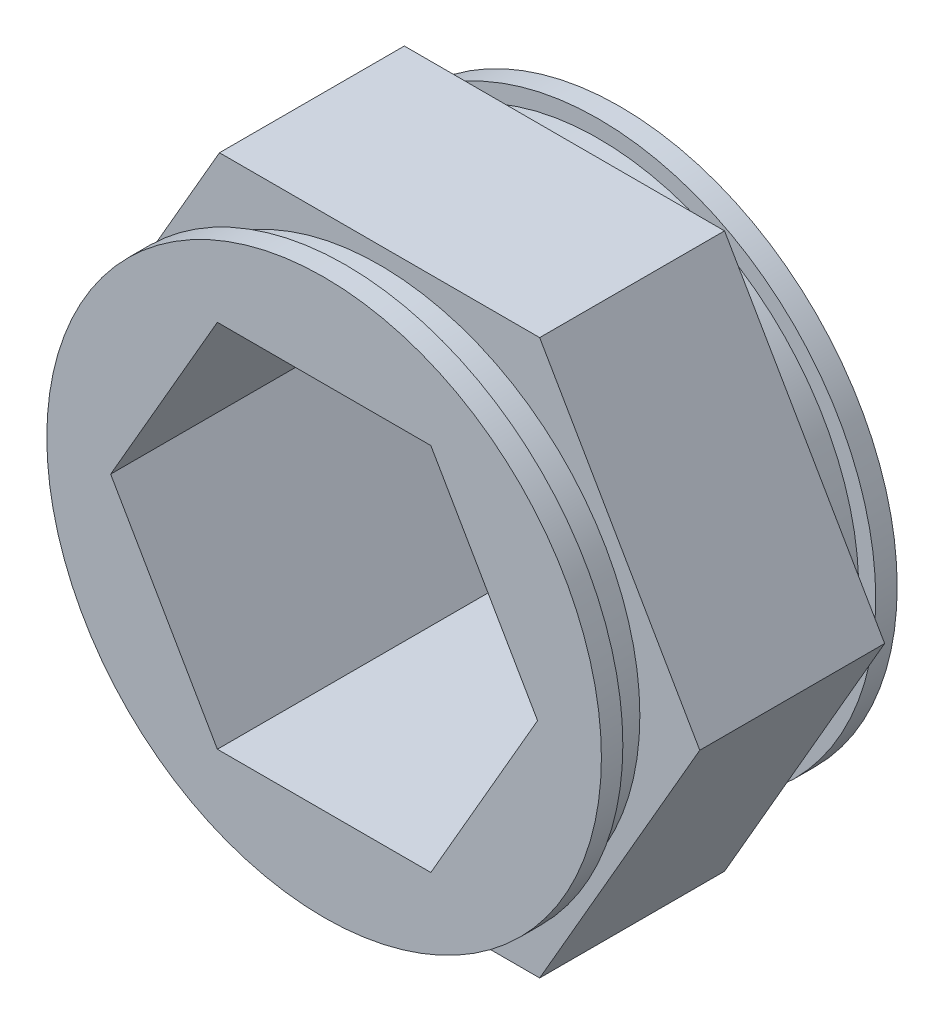
ISO-10303-21;
HEADER;
FILE_DESCRIPTION(('STEP AP214'),'2;1');
FILE_NAME('part.step','',(''),(''),'','','');
FILE_SCHEMA(('AUTOMOTIVE_DESIGN { 1 0 10303 214 1 1 1 1 }'));
ENDSEC;
DATA;
#1=APPLICATION_CONTEXT('core data for automotive mechanical design processes');
#2=APPLICATION_PROTOCOL_DEFINITION('international standard','automotive_design',2000,#1);
#3=PRODUCT_CONTEXT('',#1,'mechanical');
#4=PRODUCT('Part','Part','',(#3));
#5=PRODUCT_RELATED_PRODUCT_CATEGORY('part','',(#4));
#6=PRODUCT_DEFINITION_FORMATION('','',#4);
#7=PRODUCT_DEFINITION_CONTEXT('part definition',#1,'design');
#8=PRODUCT_DEFINITION('design','',#6,#7);
#9=PRODUCT_DEFINITION_SHAPE('','',#8);
#10=(LENGTH_UNIT() NAMED_UNIT(*) SI_UNIT(.MILLI.,.METRE.));
#11=(NAMED_UNIT(*) PLANE_ANGLE_UNIT() SI_UNIT($,.RADIAN.));
#12=(NAMED_UNIT(*) SI_UNIT($,.STERADIAN.) SOLID_ANGLE_UNIT());
#13=UNCERTAINTY_MEASURE_WITH_UNIT(LENGTH_MEASURE(1.E-05),#10,'distance_accuracy_value','');
#14=(GEOMETRIC_REPRESENTATION_CONTEXT(3) GLOBAL_UNCERTAINTY_ASSIGNED_CONTEXT((#13)) GLOBAL_UNIT_ASSIGNED_CONTEXT((#10,
#11,#12)) REPRESENTATION_CONTEXT('',''));
#15=CARTESIAN_POINT('',(0.,0.,0.));
#16=DIRECTION('',(0.,0.,1.));
#17=DIRECTION('',(1.,0.,0.));
#18=AXIS2_PLACEMENT_3D('',#15,#16,#17);
#19=CARTESIAN_POINT('',(0.,0.,0.));
#20=DIRECTION('',(0.,0.,1.));
#21=DIRECTION('',(1.,0.,0.));
#22=AXIS2_PLACEMENT_3D('',#19,#20,#21);
#23=PLANE('',#22);
#24=CARTESIAN_POINT('',(0.,0.,0.));
#25=DIRECTION('',(0.,0.,-1.));
#26=DIRECTION('',(-1.,0.,0.));
#27=AXIS2_PLACEMENT_3D('',#24,#25,#26);
#28=CIRCLE('',#27,8.9408);
#29=CARTESIAN_POINT('',(-8.9408,0.,0.));
#30=VERTEX_POINT('',#29);
#31=EDGE_CURVE('E20',#30,#30,#28,.T.);
#32=ORIENTED_EDGE('',*,*,#31,.F.);
#33=EDGE_LOOP('',(#32));
#34=FACE_BOUND('',#33,.T.);
#35=DIRECTION('',(0.5,0.866025403784438,0.));
#36=VECTOR('',#35,1.);
#37=CARTESIAN_POINT('',(5.49926131403117,-9.525,0.));
#38=LINE('',#37,#36);
#39=CARTESIAN_POINT('',(5.49926131403117,-9.525,0.));
#40=VERTEX_POINT('',#39);
#41=CARTESIAN_POINT('',(10.9985226280624,0.,0.));
#42=VERTEX_POINT('',#41);
#43=EDGE_CURVE('E179',#40,#42,#38,.T.);
#44=ORIENTED_EDGE('',*,*,#43,.F.);
#45=DIRECTION('',(1.,0.,0.));
#46=VECTOR('',#45,1.);
#47=CARTESIAN_POINT('',(-5.49926131403119,-9.525,0.));
#48=LINE('',#47,#46);
#49=CARTESIAN_POINT('',(-5.4992613140312,-9.525,0.));
#50=VERTEX_POINT('',#49);
#51=EDGE_CURVE('E184',#50,#40,#48,.T.);
#52=ORIENTED_EDGE('',*,*,#51,.F.);
#53=DIRECTION('',(0.5,-0.866025403784439,0.));
#54=VECTOR('',#53,1.);
#55=CARTESIAN_POINT('',(-10.9985226280624,0.,0.));
#56=LINE('',#55,#54);
#57=CARTESIAN_POINT('',(-10.9985226280624,0.,0.));
#58=VERTEX_POINT('',#57);
#59=EDGE_CURVE('E190',#58,#50,#56,.T.);
#60=ORIENTED_EDGE('',*,*,#59,.F.);
#61=DIRECTION('',(-0.5,-0.866025403784439,0.));
#62=VECTOR('',#61,1.);
#63=CARTESIAN_POINT('',(-5.49926131403119,9.525,0.));
#64=LINE('',#63,#62);
#65=CARTESIAN_POINT('',(-5.49926131403119,9.525,0.));
#66=VERTEX_POINT('',#65);
#67=EDGE_CURVE('E104',#66,#58,#64,.T.);
#68=ORIENTED_EDGE('',*,*,#67,.F.);
#69=DIRECTION('',(1.,0.,0.));
#70=VECTOR('',#69,1.);
#71=CARTESIAN_POINT('',(5.49926131403117,9.525,0.));
#72=LINE('',#71,#70);
#73=CARTESIAN_POINT('',(5.49926131403117,9.525,0.));
#74=VERTEX_POINT('',#73);
#75=EDGE_CURVE('E106',#74,#66,#72,.F.);
#76=ORIENTED_EDGE('',*,*,#75,.F.);
#77=DIRECTION('',(-0.5,0.866025403784439,0.));
#78=VECTOR('',#77,1.);
#79=CARTESIAN_POINT('',(10.9985226280624,0.,0.));
#80=LINE('',#79,#78);
#81=EDGE_CURVE('E108',#42,#74,#80,.T.);
#82=ORIENTED_EDGE('',*,*,#81,.F.);
#83=EDGE_LOOP('',(#44,#52,#60,#68,#76,#82));
#84=FACE_BOUND('',#83,.T.);
#85=ADVANCED_FACE('F17',(#34,#84),#23,.F.);
#86=CARTESIAN_POINT('',(10.9985226280624,0.,0.));
#87=DIRECTION('',(0.866025403784439,0.5,0.));
#88=DIRECTION('',(-0.5,0.866025403784439,0.));
#89=AXIS2_PLACEMENT_3D('',#86,#87,#88);
#90=PLANE('',#89);
#91=DIRECTION('',(-0.500000000000001,0.866025403784438,0.));
#92=VECTOR('',#91,1.);
#93=CARTESIAN_POINT('',(10.9985226280624,0.,6.35));
#94=LINE('',#93,#92);
#95=CARTESIAN_POINT('',(10.9985226280624,0.,6.35));
#96=VERTEX_POINT('',#95);
#97=CARTESIAN_POINT('',(5.49926131403117,9.525,6.35));
#98=VERTEX_POINT('',#97);
#99=EDGE_CURVE('E173',#96,#98,#94,.T.);
#100=ORIENTED_EDGE('',*,*,#99,.F.);
#101=DIRECTION('',(0.,0.,1.));
#102=VECTOR('',#101,1.);
#103=CARTESIAN_POINT('',(10.9985226280624,0.,0.));
#104=LINE('',#103,#102);
#105=EDGE_CURVE('E119',#42,#96,#104,.T.);
#106=ORIENTED_EDGE('',*,*,#105,.F.);
#107=ORIENTED_EDGE('',*,*,#81,.T.);
#108=DIRECTION('',(0.,0.,1.));
#109=VECTOR('',#108,1.);
#110=CARTESIAN_POINT('',(5.49926131403117,9.525,0.));
#111=LINE('',#110,#109);
#112=EDGE_CURVE('E113',#98,#74,#111,.F.);
#113=ORIENTED_EDGE('',*,*,#112,.F.);
#114=EDGE_LOOP('',(#100,#106,#107,#113));
#115=FACE_BOUND('',#114,.T.);
#116=ADVANCED_FACE('F116',(#115),#90,.T.);
#117=CARTESIAN_POINT('',(5.49926131403117,9.525,0.));
#118=DIRECTION('',(0.,1.,0.));
#119=DIRECTION('',(0.,0.,1.));
#120=AXIS2_PLACEMENT_3D('',#117,#118,#119);
#121=PLANE('',#120);
#122=DIRECTION('',(1.,0.,0.));
#123=VECTOR('',#122,1.);
#124=CARTESIAN_POINT('',(0.,9.525,6.35));
#125=LINE('',#124,#123);
#126=CARTESIAN_POINT('',(-5.49926131403119,9.525,6.35));
#127=VERTEX_POINT('',#126);
#128=EDGE_CURVE('E124',#98,#127,#125,.F.);
#129=ORIENTED_EDGE('',*,*,#128,.F.);
#130=ORIENTED_EDGE('',*,*,#112,.T.);
#131=ORIENTED_EDGE('',*,*,#75,.T.);
#132=DIRECTION('',(0.,0.,1.));
#133=VECTOR('',#132,1.);
#134=CARTESIAN_POINT('',(-5.49926131403119,9.525,0.));
#135=LINE('',#134,#133);
#136=EDGE_CURVE('E127',#127,#66,#135,.F.);
#137=ORIENTED_EDGE('',*,*,#136,.F.);
#138=EDGE_LOOP('',(#129,#130,#131,#137));
#139=FACE_BOUND('',#138,.T.);
#140=ADVANCED_FACE('F122',(#139),#121,.T.);
#141=CARTESIAN_POINT('',(-5.49926131403119,9.525,0.));
#142=DIRECTION('',(-0.866025403784439,0.5,0.));
#143=DIRECTION('',(-0.5,-0.866025403784439,0.));
#144=AXIS2_PLACEMENT_3D('',#141,#142,#143);
#145=PLANE('',#144);
#146=DIRECTION('',(-0.500000000000001,-0.866025403784438,0.));
#147=VECTOR('',#146,1.);
#148=CARTESIAN_POINT('',(-5.49926131403119,9.525,6.35));
#149=LINE('',#148,#147);
#150=CARTESIAN_POINT('',(-10.9985226280624,0.,6.35));
#151=VERTEX_POINT('',#150);
#152=EDGE_CURVE('E169',#127,#151,#149,.T.);
#153=ORIENTED_EDGE('',*,*,#152,.F.);
#154=ORIENTED_EDGE('',*,*,#136,.T.);
#155=ORIENTED_EDGE('',*,*,#67,.T.);
#156=DIRECTION('',(0.,0.,1.));
#157=VECTOR('',#156,1.);
#158=CARTESIAN_POINT('',(-10.9985226280624,0.,0.));
#159=LINE('',#158,#157);
#160=EDGE_CURVE('E187',#151,#58,#159,.F.);
#161=ORIENTED_EDGE('',*,*,#160,.F.);
#162=EDGE_LOOP('',(#153,#154,#155,#161));
#163=FACE_BOUND('',#162,.T.);
#164=ADVANCED_FACE('F194',(#163),#145,.T.);
#165=CARTESIAN_POINT('',(-10.9985226280624,0.,0.));
#166=DIRECTION('',(-0.866025403784439,-0.5,0.));
#167=DIRECTION('',(0.5,-0.866025403784439,0.));
#168=AXIS2_PLACEMENT_3D('',#165,#166,#167);
#169=PLANE('',#168);
#170=DIRECTION('',(0.5,-0.866025403784438,0.));
#171=VECTOR('',#170,1.);
#172=CARTESIAN_POINT('',(-10.9985226280624,0.,6.35));
#173=LINE('',#172,#171);
#174=CARTESIAN_POINT('',(-5.4992613140312,-9.525,6.35));
#175=VERTEX_POINT('',#174);
#176=EDGE_CURVE('E162',#151,#175,#173,.T.);
#177=ORIENTED_EDGE('',*,*,#176,.F.);
#178=ORIENTED_EDGE('',*,*,#160,.T.);
#179=ORIENTED_EDGE('',*,*,#59,.T.);
#180=DIRECTION('',(0.,0.,-1.));
#181=VECTOR('',#180,1.);
#182=CARTESIAN_POINT('',(-5.49926131403119,-9.525,0.));
#183=LINE('',#182,#181);
#184=EDGE_CURVE('E181',#175,#50,#183,.T.);
#185=ORIENTED_EDGE('',*,*,#184,.F.);
#186=EDGE_LOOP('',(#177,#178,#179,#185));
#187=FACE_BOUND('',#186,.T.);
#188=ADVANCED_FACE('F203',(#187),#169,.T.);
#189=CARTESIAN_POINT('',(-5.49926131403119,-9.525,0.));
#190=DIRECTION('',(0.,-1.,0.));
#191=DIRECTION('',(0.,0.,-1.));
#192=AXIS2_PLACEMENT_3D('',#189,#190,#191);
#193=PLANE('',#192);
#194=DIRECTION('',(1.,0.,0.));
#195=VECTOR('',#194,1.);
#196=CARTESIAN_POINT('',(0.,-9.525,6.35));
#197=LINE('',#196,#195);
#198=CARTESIAN_POINT('',(5.49926131403117,-9.525,6.35));
#199=VERTEX_POINT('',#198);
#200=EDGE_CURVE('E157',#175,#199,#197,.T.);
#201=ORIENTED_EDGE('',*,*,#200,.F.);
#202=ORIENTED_EDGE('',*,*,#184,.T.);
#203=ORIENTED_EDGE('',*,*,#51,.T.);
#204=DIRECTION('',(0.,0.,1.));
#205=VECTOR('',#204,1.);
#206=CARTESIAN_POINT('',(5.49926131403117,-9.525,0.));
#207=LINE('',#206,#205);
#208=EDGE_CURVE('E175',#199,#40,#207,.F.);
#209=ORIENTED_EDGE('',*,*,#208,.F.);
#210=EDGE_LOOP('',(#201,#202,#203,#209));
#211=FACE_BOUND('',#210,.T.);
#212=ADVANCED_FACE('F201',(#211),#193,.T.);
#213=CARTESIAN_POINT('',(5.49926131403117,-9.525,0.));
#214=DIRECTION('',(0.866025403784438,-0.5,0.));
#215=DIRECTION('',(0.5,0.866025403784438,0.));
#216=AXIS2_PLACEMENT_3D('',#213,#214,#215);
#217=PLANE('',#216);
#218=DIRECTION('',(0.500000000000001,0.866025403784438,0.));
#219=VECTOR('',#218,1.);
#220=CARTESIAN_POINT('',(5.49926131403117,-9.525,6.35));
#221=LINE('',#220,#219);
#222=EDGE_CURVE('E153',#199,#96,#221,.T.);
#223=ORIENTED_EDGE('',*,*,#222,.F.);
#224=ORIENTED_EDGE('',*,*,#208,.T.);
#225=ORIENTED_EDGE('',*,*,#43,.T.);
#226=ORIENTED_EDGE('',*,*,#105,.T.);
#227=EDGE_LOOP('',(#223,#224,#225,#226));
#228=FACE_BOUND('',#227,.T.);
#229=ADVANCED_FACE('F198',(#228),#217,.T.);
#230=CARTESIAN_POINT('',(0.,0.,0.));
#231=DIRECTION('',(0.,0.,-1.));
#232=DIRECTION('',(-1.,0.,0.));
#233=AXIS2_PLACEMENT_3D('',#230,#231,#232);
#234=CYLINDRICAL_SURFACE('',#233,8.9408);
#235=ORIENTED_EDGE('',*,*,#31,.T.);
#236=EDGE_LOOP('',(#235));
#237=FACE_BOUND('',#236,.T.);
#238=CARTESIAN_POINT('',(0.,0.,-1.1684));
#239=DIRECTION('',(0.,0.,-1.));
#240=DIRECTION('',(-1.,0.,0.));
#241=AXIS2_PLACEMENT_3D('',#238,#239,#240);
#242=CIRCLE('',#241,8.9408);
#243=CARTESIAN_POINT('',(-8.9408,0.,-1.1684));
#244=VERTEX_POINT('',#243);
#245=EDGE_CURVE('E151',#244,#244,#242,.T.);
#246=ORIENTED_EDGE('',*,*,#245,.F.);
#247=EDGE_LOOP('',(#246));
#248=FACE_BOUND('',#247,.T.);
#249=ADVANCED_FACE('F270',(#237,#248),#234,.T.);
#250=CARTESIAN_POINT('',(0.,0.,6.35));
#251=DIRECTION('',(0.,0.,1.));
#252=DIRECTION('',(1.,0.,0.));
#253=AXIS2_PLACEMENT_3D('',#250,#251,#252);
#254=PLANE('',#253);
#255=CARTESIAN_POINT('',(0.,0.,6.35));
#256=DIRECTION('',(0.,0.,1.));
#257=DIRECTION('',(1.,0.,0.));
#258=AXIS2_PLACEMENT_3D('',#255,#256,#257);
#259=CIRCLE('',#258,8.9408);
#260=CARTESIAN_POINT('',(8.9408,0.,6.35));
#261=VERTEX_POINT('',#260);
#262=EDGE_CURVE('E149',#261,#261,#259,.T.);
#263=ORIENTED_EDGE('',*,*,#262,.F.);
#264=EDGE_LOOP('',(#263));
#265=FACE_BOUND('',#264,.T.);
#266=ORIENTED_EDGE('',*,*,#200,.T.);
#267=ORIENTED_EDGE('',*,*,#222,.T.);
#268=ORIENTED_EDGE('',*,*,#99,.T.);
#269=ORIENTED_EDGE('',*,*,#128,.T.);
#270=ORIENTED_EDGE('',*,*,#152,.T.);
#271=ORIENTED_EDGE('',*,*,#176,.T.);
#272=EDGE_LOOP('',(#266,#267,#268,#269,#270,#271));
#273=FACE_BOUND('',#272,.T.);
#274=ADVANCED_FACE('F196',(#265,#273),#254,.T.);
#275=CARTESIAN_POINT('',(0.,0.,-1.1684));
#276=DIRECTION('',(0.,0.,1.));
#277=DIRECTION('',(1.,0.,0.));
#278=AXIS2_PLACEMENT_3D('',#275,#276,#277);
#279=PLANE('',#278);
#280=ORIENTED_EDGE('',*,*,#245,.T.);
#281=EDGE_LOOP('',(#280));
#282=FACE_BOUND('',#281,.T.);
#283=CARTESIAN_POINT('',(0.,0.,-1.1684));
#284=DIRECTION('',(0.,0.,-1.));
#285=DIRECTION('',(-1.,0.,0.));
#286=AXIS2_PLACEMENT_3D('',#283,#284,#285);
#287=CIRCLE('',#286,9.525);
#288=CARTESIAN_POINT('',(-9.525,0.,-1.1684));
#289=VERTEX_POINT('',#288);
#290=EDGE_CURVE('E146',#289,#289,#287,.T.);
#291=ORIENTED_EDGE('',*,*,#290,.F.);
#292=EDGE_LOOP('',(#291));
#293=FACE_BOUND('',#292,.T.);
#294=ADVANCED_FACE('F264',(#282,#293),#279,.T.);
#295=CARTESIAN_POINT('',(0.,0.,6.35));
#296=DIRECTION('',(0.,0.,1.));
#297=DIRECTION('',(1.,0.,0.));
#298=AXIS2_PLACEMENT_3D('',#295,#296,#297);
#299=CYLINDRICAL_SURFACE('',#298,8.9408);
#300=ORIENTED_EDGE('',*,*,#262,.T.);
#301=EDGE_LOOP('',(#300));
#302=FACE_BOUND('',#301,.T.);
#303=CARTESIAN_POINT('',(0.,0.,7.5184));
#304=DIRECTION('',(0.,0.,1.));
#305=DIRECTION('',(1.,0.,0.));
#306=AXIS2_PLACEMENT_3D('',#303,#304,#305);
#307=CIRCLE('',#306,8.9408);
#308=CARTESIAN_POINT('',(8.9408,0.,7.5184));
#309=VERTEX_POINT('',#308);
#310=EDGE_CURVE('E143',#309,#309,#307,.F.);
#311=ORIENTED_EDGE('',*,*,#310,.T.);
#312=EDGE_LOOP('',(#311));
#313=FACE_BOUND('',#312,.T.);
#314=ADVANCED_FACE('F260',(#302,#313),#299,.T.);
#315=CARTESIAN_POINT('',(0.,0.,-1.1684));
#316=DIRECTION('',(0.,0.,-1.));
#317=DIRECTION('',(-1.,0.,0.));
#318=AXIS2_PLACEMENT_3D('',#315,#316,#317);
#319=CYLINDRICAL_SURFACE('',#318,9.525);
#320=ORIENTED_EDGE('',*,*,#290,.T.);
#321=EDGE_LOOP('',(#320));
#322=FACE_BOUND('',#321,.T.);
#323=CARTESIAN_POINT('',(0.,0.,-1.905));
#324=DIRECTION('',(0.,0.,-1.));
#325=DIRECTION('',(-1.,0.,0.));
#326=AXIS2_PLACEMENT_3D('',#323,#324,#325);
#327=CIRCLE('',#326,9.525);
#328=CARTESIAN_POINT('',(-9.525,0.,-1.905));
#329=VERTEX_POINT('',#328);
#330=EDGE_CURVE('E140',#329,#329,#327,.F.);
#331=ORIENTED_EDGE('',*,*,#330,.T.);
#332=EDGE_LOOP('',(#331));
#333=FACE_BOUND('',#332,.T.);
#334=ADVANCED_FACE('F256',(#322,#333),#319,.T.);
#335=CARTESIAN_POINT('',(0.,0.,7.5184));
#336=DIRECTION('',(0.,0.,1.));
#337=DIRECTION('',(1.,0.,0.));
#338=AXIS2_PLACEMENT_3D('',#335,#336,#337);
#339=PLANE('',#338);
#340=ORIENTED_EDGE('',*,*,#310,.F.);
#341=EDGE_LOOP('',(#340));
#342=FACE_BOUND('',#341,.T.);
#343=CARTESIAN_POINT('',(0.,0.,7.5184));
#344=DIRECTION('',(0.,0.,1.));
#345=DIRECTION('',(1.,0.,0.));
#346=AXIS2_PLACEMENT_3D('',#343,#344,#345);
#347=CIRCLE('',#346,9.525);
#348=CARTESIAN_POINT('',(9.525,0.,7.5184));
#349=VERTEX_POINT('',#348);
#350=EDGE_CURVE('E136',#349,#349,#347,.T.);
#351=ORIENTED_EDGE('',*,*,#350,.F.);
#352=EDGE_LOOP('',(#351));
#353=FACE_BOUND('',#352,.T.);
#354=ADVANCED_FACE('F252',(#342,#353),#339,.F.);
#355=CARTESIAN_POINT('',(0.,0.,-1.905));
#356=DIRECTION('',(0.,0.,1.));
#357=DIRECTION('',(1.,0.,0.));
#358=AXIS2_PLACEMENT_3D('',#355,#356,#357);
#359=PLANE('',#358);
#360=DIRECTION('',(-0.5,-0.866025403784439,0.));
#361=VECTOR('',#360,1.);
#362=CARTESIAN_POINT('',(-3.66617420935411,6.35,-1.905));
#363=LINE('',#362,#361);
#364=CARTESIAN_POINT('',(-3.66617420935411,6.35,-1.905));
#365=VERTEX_POINT('',#364);
#366=CARTESIAN_POINT('',(-7.33234841870825,0.,-1.905));
#367=VERTEX_POINT('',#366);
#368=EDGE_CURVE('E386',#365,#367,#363,.T.);
#369=ORIENTED_EDGE('',*,*,#368,.T.);
#370=DIRECTION('',(0.5,-0.866025403784439,0.));
#371=VECTOR('',#370,1.);
#372=CARTESIAN_POINT('',(-7.33234841870825,0.,-1.905));
#373=LINE('',#372,#371);
#374=CARTESIAN_POINT('',(-3.66617420935412,-6.35,-1.905));
#375=VERTEX_POINT('',#374);
#376=EDGE_CURVE('E139',#367,#375,#373,.T.);
#377=ORIENTED_EDGE('',*,*,#376,.T.);
#378=DIRECTION('',(1.,0.,0.));
#379=VECTOR('',#378,1.);
#380=CARTESIAN_POINT('',(-3.66617420935411,-6.35,-1.905));
#381=LINE('',#380,#379);
#382=CARTESIAN_POINT('',(3.66617420935411,-6.35,-1.905));
#383=VERTEX_POINT('',#382);
#384=EDGE_CURVE('E413',#375,#383,#381,.T.);
#385=ORIENTED_EDGE('',*,*,#384,.T.);
#386=DIRECTION('',(0.5,0.866025403784438,0.));
#387=VECTOR('',#386,1.);
#388=CARTESIAN_POINT('',(3.66617420935411,-6.35,-1.905));
#389=LINE('',#388,#387);
#390=CARTESIAN_POINT('',(7.33234841870825,0.,-1.905));
#391=VERTEX_POINT('',#390);
#392=EDGE_CURVE('E409',#383,#391,#389,.T.);
#393=ORIENTED_EDGE('',*,*,#392,.T.);
#394=DIRECTION('',(-0.5,0.866025403784439,0.));
#395=VECTOR('',#394,1.);
#396=CARTESIAN_POINT('',(7.33234841870825,0.,-1.905));
#397=LINE('',#396,#395);
#398=CARTESIAN_POINT('',(3.66617420935411,6.35,-1.905));
#399=VERTEX_POINT('',#398);
#400=EDGE_CURVE('E405',#391,#399,#397,.T.);
#401=ORIENTED_EDGE('',*,*,#400,.T.);
#402=DIRECTION('',(1.,0.,0.));
#403=VECTOR('',#402,1.);
#404=CARTESIAN_POINT('',(3.66617420935411,6.35,-1.905));
#405=LINE('',#404,#403);
#406=EDGE_CURVE('E390',#399,#365,#405,.F.);
#407=ORIENTED_EDGE('',*,*,#406,.T.);
#408=EDGE_LOOP('',(#369,#377,#385,#393,#401,#407));
#409=FACE_BOUND('',#408,.T.);
#410=ORIENTED_EDGE('',*,*,#330,.F.);
#411=EDGE_LOOP('',(#410));
#412=FACE_BOUND('',#411,.T.);
#413=ADVANCED_FACE('F248',(#409,#412),#359,.F.);
#414=CARTESIAN_POINT('',(0.,0.,7.5184));
#415=DIRECTION('',(0.,0.,1.));
#416=DIRECTION('',(1.,0.,0.));
#417=AXIS2_PLACEMENT_3D('',#414,#415,#416);
#418=CYLINDRICAL_SURFACE('',#417,9.525);
#419=ORIENTED_EDGE('',*,*,#350,.T.);
#420=EDGE_LOOP('',(#419));
#421=FACE_BOUND('',#420,.T.);
#422=CARTESIAN_POINT('',(0.,0.,8.255));
#423=DIRECTION('',(0.,0.,1.));
#424=DIRECTION('',(1.,0.,0.));
#425=AXIS2_PLACEMENT_3D('',#422,#423,#424);
#426=CIRCLE('',#425,9.525);
#427=CARTESIAN_POINT('',(9.525,0.,8.255));
#428=VERTEX_POINT('',#427);
#429=EDGE_CURVE('E131',#428,#428,#426,.T.);
#430=ORIENTED_EDGE('',*,*,#429,.F.);
#431=EDGE_LOOP('',(#430));
#432=FACE_BOUND('',#431,.T.);
#433=ADVANCED_FACE('F244',(#421,#432),#418,.T.);
#434=CARTESIAN_POINT('',(-7.33234841870825,0.,0.));
#435=DIRECTION('',(-0.866025403784439,-0.5,0.));
#436=DIRECTION('',(0.5,-0.866025403784439,0.));
#437=AXIS2_PLACEMENT_3D('',#434,#435,#436);
#438=PLANE('',#437);
#439=DIRECTION('',(-0.500000000000001,0.866025403784438,0.));
#440=VECTOR('',#439,1.);
#441=CARTESIAN_POINT('',(-3.66617420935411,-6.35,8.255));
#442=LINE('',#441,#440);
#443=CARTESIAN_POINT('',(-3.66617420935412,-6.35,8.255));
#444=VERTEX_POINT('',#443);
#445=CARTESIAN_POINT('',(-7.33234841870825,0.,8.25500000000001));
#446=VERTEX_POINT('',#445);
#447=EDGE_CURVE('E134',#444,#446,#442,.T.);
#448=ORIENTED_EDGE('',*,*,#447,.F.);
#449=DIRECTION('',(0.,0.,-1.));
#450=VECTOR('',#449,1.);
#451=CARTESIAN_POINT('',(-3.66617420935411,-6.35,0.));
#452=LINE('',#451,#450);
#453=EDGE_CURVE('E135',#444,#375,#452,.T.);
#454=ORIENTED_EDGE('',*,*,#453,.T.);
#455=ORIENTED_EDGE('',*,*,#376,.F.);
#456=DIRECTION('',(0.,0.,1.));
#457=VECTOR('',#456,1.);
#458=CARTESIAN_POINT('',(-7.33234841870824,0.,0.));
#459=LINE('',#458,#457);
#460=EDGE_CURVE('E393',#367,#446,#459,.T.);
#461=ORIENTED_EDGE('',*,*,#460,.T.);
#462=EDGE_LOOP('',(#448,#454,#455,#461));
#463=FACE_BOUND('',#462,.T.);
#464=ADVANCED_FACE('F240',(#463),#438,.F.);
#465=CARTESIAN_POINT('',(-3.66617420935411,6.35,0.));
#466=DIRECTION('',(-0.866025403784439,0.5,0.));
#467=DIRECTION('',(-0.5,-0.866025403784439,0.));
#468=AXIS2_PLACEMENT_3D('',#465,#466,#467);
#469=PLANE('',#468);
#470=DIRECTION('',(0.500000000000001,0.866025403784438,0.));
#471=VECTOR('',#470,1.);
#472=CARTESIAN_POINT('',(-7.33234841870825,0.,8.255));
#473=LINE('',#472,#471);
#474=CARTESIAN_POINT('',(-3.66617420935411,6.35,8.255));
#475=VERTEX_POINT('',#474);
#476=EDGE_CURVE('E398',#446,#475,#473,.T.);
#477=ORIENTED_EDGE('',*,*,#476,.F.);
#478=ORIENTED_EDGE('',*,*,#460,.F.);
#479=ORIENTED_EDGE('',*,*,#368,.F.);
#480=DIRECTION('',(0.,0.,1.));
#481=VECTOR('',#480,1.);
#482=CARTESIAN_POINT('',(-3.66617420935411,6.35,0.));
#483=LINE('',#482,#481);
#484=EDGE_CURVE('E401',#365,#475,#483,.T.);
#485=ORIENTED_EDGE('',*,*,#484,.T.);
#486=EDGE_LOOP('',(#477,#478,#479,#485));
#487=FACE_BOUND('',#486,.T.);
#488=ADVANCED_FACE('F236',(#487),#469,.F.);
#489=CARTESIAN_POINT('',(3.66617420935411,6.35,0.));
#490=DIRECTION('',(0.,1.,0.));
#491=DIRECTION('',(0.,0.,1.));
#492=AXIS2_PLACEMENT_3D('',#489,#490,#491);
#493=PLANE('',#492);
#494=DIRECTION('',(1.,0.,0.));
#495=VECTOR('',#494,1.);
#496=CARTESIAN_POINT('',(0.,6.35,8.255));
#497=LINE('',#496,#495);
#498=CARTESIAN_POINT('',(3.66617420935411,6.35,8.255));
#499=VERTEX_POINT('',#498);
#500=EDGE_CURVE('E419',#475,#499,#497,.T.);
#501=ORIENTED_EDGE('',*,*,#500,.F.);
#502=ORIENTED_EDGE('',*,*,#484,.F.);
#503=ORIENTED_EDGE('',*,*,#406,.F.);
#504=DIRECTION('',(0.,0.,1.));
#505=VECTOR('',#504,1.);
#506=CARTESIAN_POINT('',(3.66617420935412,6.35000000000001,0.));
#507=LINE('',#506,#505);
#508=EDGE_CURVE('E407',#399,#499,#507,.T.);
#509=ORIENTED_EDGE('',*,*,#508,.T.);
#510=EDGE_LOOP('',(#501,#502,#503,#509));
#511=FACE_BOUND('',#510,.T.);
#512=ADVANCED_FACE('F232',(#511),#493,.F.);
#513=CARTESIAN_POINT('',(7.33234841870825,0.,0.));
#514=DIRECTION('',(0.866025403784439,0.5,0.));
#515=DIRECTION('',(-0.5,0.866025403784439,0.));
#516=AXIS2_PLACEMENT_3D('',#513,#514,#515);
#517=PLANE('',#516);
#518=DIRECTION('',(0.500000000000001,-0.866025403784438,0.));
#519=VECTOR('',#518,1.);
#520=CARTESIAN_POINT('',(3.66617420935411,6.35,8.255));
#521=LINE('',#520,#519);
#522=CARTESIAN_POINT('',(7.33234841870825,0.,8.25500000000001));
#523=VERTEX_POINT('',#522);
#524=EDGE_CURVE('E422',#499,#523,#521,.T.);
#525=ORIENTED_EDGE('',*,*,#524,.F.);
#526=ORIENTED_EDGE('',*,*,#508,.F.);
#527=ORIENTED_EDGE('',*,*,#400,.F.);
#528=DIRECTION('',(0.,0.,1.));
#529=VECTOR('',#528,1.);
#530=CARTESIAN_POINT('',(7.33234841870824,0.,0.));
#531=LINE('',#530,#529);
#532=EDGE_CURVE('E411',#391,#523,#531,.T.);
#533=ORIENTED_EDGE('',*,*,#532,.T.);
#534=EDGE_LOOP('',(#525,#526,#527,#533));
#535=FACE_BOUND('',#534,.T.);
#536=ADVANCED_FACE('F229',(#535),#517,.F.);
#537=CARTESIAN_POINT('',(3.66617420935411,-6.35,0.));
#538=DIRECTION('',(0.866025403784438,-0.5,0.));
#539=DIRECTION('',(0.5,0.866025403784438,0.));
#540=AXIS2_PLACEMENT_3D('',#537,#538,#539);
#541=PLANE('',#540);
#542=DIRECTION('',(-0.500000000000002,-0.866025403784438,0.));
#543=VECTOR('',#542,1.);
#544=CARTESIAN_POINT('',(7.33234841870825,0.,8.255));
#545=LINE('',#544,#543);
#546=CARTESIAN_POINT('',(3.66617420935411,-6.35,8.255));
#547=VERTEX_POINT('',#546);
#548=EDGE_CURVE('E26',#523,#547,#545,.T.);
#549=ORIENTED_EDGE('',*,*,#548,.F.);
#550=ORIENTED_EDGE('',*,*,#532,.F.);
#551=ORIENTED_EDGE('',*,*,#392,.F.);
#552=DIRECTION('',(0.,0.,-1.));
#553=VECTOR('',#552,1.);
#554=CARTESIAN_POINT('',(3.66617420935411,-6.35,0.));
#555=LINE('',#554,#553);
#556=EDGE_CURVE('E35',#383,#547,#555,.F.);
#557=ORIENTED_EDGE('',*,*,#556,.T.);
#558=EDGE_LOOP('',(#549,#550,#551,#557));
#559=FACE_BOUND('',#558,.T.);
#560=ADVANCED_FACE('F221',(#559),#541,.F.);
#561=CARTESIAN_POINT('',(-3.66617420935411,-6.35,0.));
#562=DIRECTION('',(0.,-1.,0.));
#563=DIRECTION('',(0.,0.,-1.));
#564=AXIS2_PLACEMENT_3D('',#561,#562,#563);
#565=PLANE('',#564);
#566=DIRECTION('',(1.,0.,0.));
#567=VECTOR('',#566,1.);
#568=CARTESIAN_POINT('',(0.,-6.35,8.255));
#569=LINE('',#568,#567);
#570=EDGE_CURVE('E11',#547,#444,#569,.F.);
#571=ORIENTED_EDGE('',*,*,#570,.F.);
#572=ORIENTED_EDGE('',*,*,#556,.F.);
#573=ORIENTED_EDGE('',*,*,#384,.F.);
#574=ORIENTED_EDGE('',*,*,#453,.F.);
#575=EDGE_LOOP('',(#571,#572,#573,#574));
#576=FACE_BOUND('',#575,.T.);
#577=ADVANCED_FACE('F215',(#576),#565,.F.);
#578=CARTESIAN_POINT('',(0.,0.,8.255));
#579=DIRECTION('',(0.,0.,1.));
#580=DIRECTION('',(1.,0.,0.));
#581=AXIS2_PLACEMENT_3D('',#578,#579,#580);
#582=PLANE('',#581);
#583=ORIENTED_EDGE('',*,*,#548,.T.);
#584=ORIENTED_EDGE('',*,*,#570,.T.);
#585=ORIENTED_EDGE('',*,*,#447,.T.);
#586=ORIENTED_EDGE('',*,*,#476,.T.);
#587=ORIENTED_EDGE('',*,*,#500,.T.);
#588=ORIENTED_EDGE('',*,*,#524,.T.);
#589=EDGE_LOOP('',(#583,#584,#585,#586,#587,#588));
#590=FACE_BOUND('',#589,.T.);
#591=ORIENTED_EDGE('',*,*,#429,.T.);
#592=EDGE_LOOP('',(#591));
#593=FACE_BOUND('',#592,.T.);
#594=ADVANCED_FACE('F213',(#590,#593),#582,.T.);
#595=CLOSED_SHELL('',(#85,#116,#140,#164,#188,#212,#229,#249,#274,#294,#314,#334,#354,#413,#433,
#464,#488,#512,#536,#560,#577,#594));
#596=MANIFOLD_SOLID_BREP('B1',#595);
#597=ADVANCED_BREP_SHAPE_REPRESENTATION('',(#18,#596),#14);
#598=SHAPE_DEFINITION_REPRESENTATION(#9,#597);
ENDSEC;
END-ISO-10303-21;
